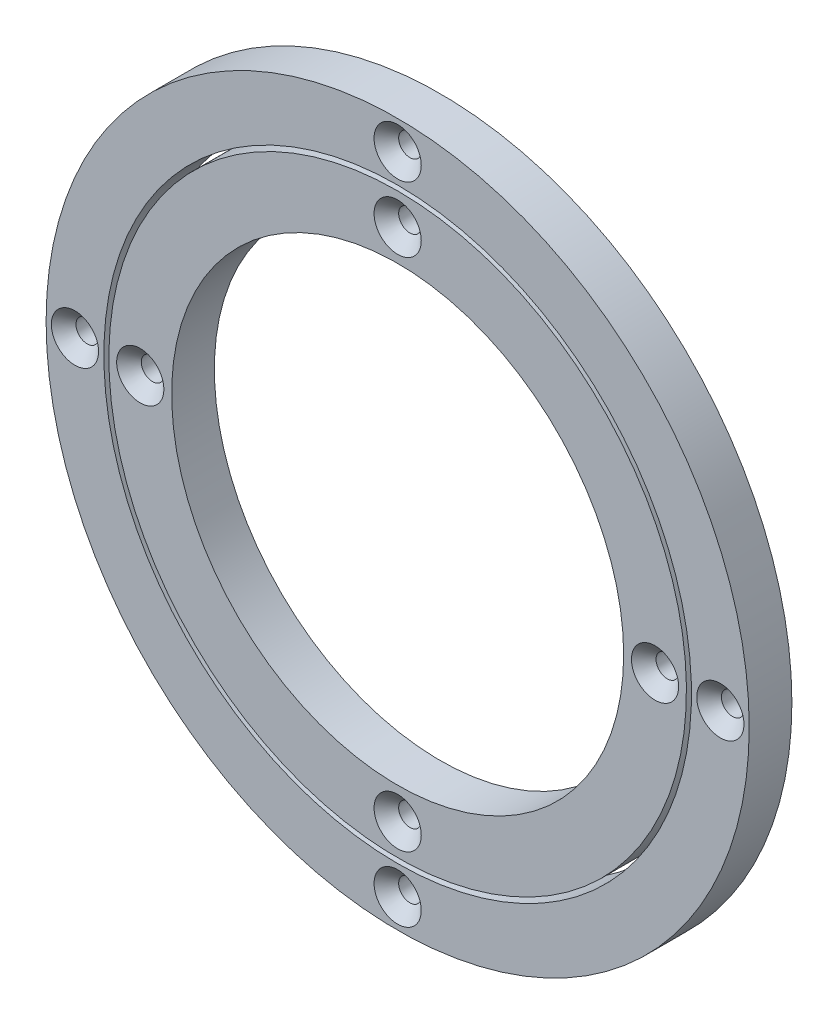
ISO-10303-21;
HEADER;
FILE_DESCRIPTION(('STEP AP214'),'2;1');
FILE_NAME('part.step','',(''),(''),'','','');
FILE_SCHEMA(('AUTOMOTIVE_DESIGN { 1 0 10303 214 1 1 1 1 }'));
ENDSEC;
DATA;
#1=APPLICATION_CONTEXT('core data for automotive mechanical design processes');
#2=APPLICATION_PROTOCOL_DEFINITION('international standard','automotive_design',2000,#1);
#3=PRODUCT_CONTEXT('',#1,'mechanical');
#4=PRODUCT('Part','Part','',(#3));
#5=PRODUCT_RELATED_PRODUCT_CATEGORY('part','',(#4));
#6=PRODUCT_DEFINITION_FORMATION('','',#4);
#7=PRODUCT_DEFINITION_CONTEXT('part definition',#1,'design');
#8=PRODUCT_DEFINITION('design','',#6,#7);
#9=PRODUCT_DEFINITION_SHAPE('','',#8);
#10=(LENGTH_UNIT() NAMED_UNIT(*) SI_UNIT(.MILLI.,.METRE.));
#11=(NAMED_UNIT(*) PLANE_ANGLE_UNIT() SI_UNIT($,.RADIAN.));
#12=(NAMED_UNIT(*) SI_UNIT($,.STERADIAN.) SOLID_ANGLE_UNIT());
#13=UNCERTAINTY_MEASURE_WITH_UNIT(LENGTH_MEASURE(1.E-05),#10,'distance_accuracy_value','');
#14=(GEOMETRIC_REPRESENTATION_CONTEXT(3) GLOBAL_UNCERTAINTY_ASSIGNED_CONTEXT((#13)) GLOBAL_UNIT_ASSIGNED_CONTEXT((#10,
#11,#12)) REPRESENTATION_CONTEXT('',''));
#15=CARTESIAN_POINT('',(0.,0.,0.));
#16=DIRECTION('',(0.,0.,1.));
#17=DIRECTION('',(1.,0.,0.));
#18=AXIS2_PLACEMENT_3D('',#15,#16,#17);
#19=CARTESIAN_POINT('',(0.,0.,8.5));
#20=DIRECTION('',(0.,0.,1.));
#21=DIRECTION('',(1.,0.,0.));
#22=AXIS2_PLACEMENT_3D('',#19,#20,#21);
#23=PLANE('',#22);
#24=CARTESIAN_POINT('',(64.25,0.,8.5));
#25=DIRECTION('',(0.,0.,1.));
#26=DIRECTION('',(1.,0.,0.));
#27=AXIS2_PLACEMENT_3D('',#24,#25,#26);
#28=CIRCLE('',#27,4.7);
#29=CARTESIAN_POINT('',(68.95,0.,8.5));
#30=VERTEX_POINT('',#29);
#31=EDGE_CURVE('E116',#30,#30,#28,.T.);
#32=ORIENTED_EDGE('',*,*,#31,.F.);
#33=EDGE_LOOP('',(#32));
#34=FACE_BOUND('',#33,.T.);
#35=CARTESIAN_POINT('',(0.,-64.25,8.5));
#36=DIRECTION('',(0.,0.,1.));
#37=DIRECTION('',(1.,0.,0.));
#38=AXIS2_PLACEMENT_3D('',#35,#36,#37);
#39=CIRCLE('',#38,4.7);
#40=CARTESIAN_POINT('',(4.7,-64.25,8.5));
#41=VERTEX_POINT('',#40);
#42=EDGE_CURVE('E107',#41,#41,#39,.T.);
#43=ORIENTED_EDGE('',*,*,#42,.F.);
#44=EDGE_LOOP('',(#43));
#45=FACE_BOUND('',#44,.T.);
#46=CARTESIAN_POINT('',(0.,64.25,8.5));
#47=DIRECTION('',(0.,0.,1.));
#48=DIRECTION('',(1.,0.,0.));
#49=AXIS2_PLACEMENT_3D('',#46,#47,#48);
#50=CIRCLE('',#49,4.7);
#51=CARTESIAN_POINT('',(4.7,64.25,8.5));
#52=VERTEX_POINT('',#51);
#53=EDGE_CURVE('E98',#52,#52,#50,.T.);
#54=ORIENTED_EDGE('',*,*,#53,.F.);
#55=EDGE_LOOP('',(#54));
#56=FACE_BOUND('',#55,.T.);
#57=CARTESIAN_POINT('',(-64.25,0.,8.5));
#58=DIRECTION('',(0.,0.,1.));
#59=DIRECTION('',(1.,0.,0.));
#60=AXIS2_PLACEMENT_3D('',#57,#58,#59);
#61=CIRCLE('',#60,4.7);
#62=CARTESIAN_POINT('',(-59.55,0.,8.5));
#63=VERTEX_POINT('',#62);
#64=EDGE_CURVE('E86',#63,#63,#61,.T.);
#65=ORIENTED_EDGE('',*,*,#64,.F.);
#66=EDGE_LOOP('',(#65));
#67=FACE_BOUND('',#66,.T.);
#68=CARTESIAN_POINT('',(0.,0.,8.5));
#69=DIRECTION('',(0.,0.,1.));
#70=DIRECTION('',(0.,1.,0.));
#71=AXIS2_PLACEMENT_3D('',#68,#69,#70);
#72=CIRCLE('',#71,58.5);
#73=CARTESIAN_POINT('',(0.,58.5,8.5));
#74=VERTEX_POINT('',#73);
#75=EDGE_CURVE('E12',#74,#74,#72,.T.);
#76=ORIENTED_EDGE('',*,*,#75,.F.);
#77=EDGE_LOOP('',(#76));
#78=FACE_BOUND('',#77,.T.);
#79=CARTESIAN_POINT('',(0.,0.,8.5));
#80=DIRECTION('',(0.,0.,1.));
#81=DIRECTION('',(1.,0.,0.));
#82=AXIS2_PLACEMENT_3D('',#79,#80,#81);
#83=CIRCLE('',#82,70.);
#84=CARTESIAN_POINT('',(70.,0.,8.5));
#85=VERTEX_POINT('',#84);
#86=EDGE_CURVE('E73',#85,#85,#83,.T.);
#87=ORIENTED_EDGE('',*,*,#86,.T.);
#88=EDGE_LOOP('',(#87));
#89=FACE_BOUND('',#88,.T.);
#90=ADVANCED_FACE('F57',(#34,#45,#56,#67,#78,#89),#23,.T.);
#91=CARTESIAN_POINT('',(0.,0.,0.));
#92=DIRECTION('',(0.,0.,1.));
#93=DIRECTION('',(1.,0.,0.));
#94=AXIS2_PLACEMENT_3D('',#91,#92,#93);
#95=PLANE('',#94);
#96=CARTESIAN_POINT('',(64.25,0.,0.));
#97=DIRECTION('',(0.,0.,1.));
#98=DIRECTION('',(1.,0.,0.));
#99=AXIS2_PLACEMENT_3D('',#96,#97,#98);
#100=CIRCLE('',#99,2.25);
#101=CARTESIAN_POINT('',(66.5,0.,0.));
#102=VERTEX_POINT('',#101);
#103=EDGE_CURVE('E110',#102,#102,#100,.T.);
#104=ORIENTED_EDGE('',*,*,#103,.T.);
#105=EDGE_LOOP('',(#104));
#106=FACE_BOUND('',#105,.T.);
#107=CARTESIAN_POINT('',(0.,-64.25,0.));
#108=DIRECTION('',(0.,0.,1.));
#109=DIRECTION('',(1.,0.,0.));
#110=AXIS2_PLACEMENT_3D('',#107,#108,#109);
#111=CIRCLE('',#110,2.25);
#112=CARTESIAN_POINT('',(2.25,-64.25,0.));
#113=VERTEX_POINT('',#112);
#114=EDGE_CURVE('E101',#113,#113,#111,.T.);
#115=ORIENTED_EDGE('',*,*,#114,.T.);
#116=EDGE_LOOP('',(#115));
#117=FACE_BOUND('',#116,.T.);
#118=CARTESIAN_POINT('',(0.,64.25,0.));
#119=DIRECTION('',(0.,0.,1.));
#120=DIRECTION('',(1.,0.,0.));
#121=AXIS2_PLACEMENT_3D('',#118,#119,#120);
#122=CIRCLE('',#121,2.25);
#123=CARTESIAN_POINT('',(2.25,64.25,0.));
#124=VERTEX_POINT('',#123);
#125=EDGE_CURVE('E90',#124,#124,#122,.T.);
#126=ORIENTED_EDGE('',*,*,#125,.T.);
#127=EDGE_LOOP('',(#126));
#128=FACE_BOUND('',#127,.T.);
#129=CARTESIAN_POINT('',(-64.25,0.,0.));
#130=DIRECTION('',(0.,0.,1.));
#131=DIRECTION('',(1.,0.,0.));
#132=AXIS2_PLACEMENT_3D('',#129,#130,#131);
#133=CIRCLE('',#132,2.25);
#134=CARTESIAN_POINT('',(-62.,0.,0.));
#135=VERTEX_POINT('',#134);
#136=EDGE_CURVE('E76',#135,#135,#133,.T.);
#137=ORIENTED_EDGE('',*,*,#136,.T.);
#138=EDGE_LOOP('',(#137));
#139=FACE_BOUND('',#138,.T.);
#140=CARTESIAN_POINT('',(0.,0.,0.));
#141=DIRECTION('',(0.,0.,1.));
#142=DIRECTION('',(0.,1.,0.));
#143=AXIS2_PLACEMENT_3D('',#140,#141,#142);
#144=CIRCLE('',#143,58.5);
#145=CARTESIAN_POINT('',(0.,58.5,0.));
#146=VERTEX_POINT('',#145);
#147=EDGE_CURVE('E68',#146,#146,#144,.T.);
#148=ORIENTED_EDGE('',*,*,#147,.T.);
#149=EDGE_LOOP('',(#148));
#150=FACE_BOUND('',#149,.T.);
#151=CARTESIAN_POINT('',(0.,0.,0.));
#152=DIRECTION('',(0.,0.,1.));
#153=DIRECTION('',(1.,0.,0.));
#154=AXIS2_PLACEMENT_3D('',#151,#152,#153);
#155=CIRCLE('',#154,70.);
#156=CARTESIAN_POINT('',(70.,0.,0.));
#157=VERTEX_POINT('',#156);
#158=EDGE_CURVE('E64',#157,#157,#155,.T.);
#159=ORIENTED_EDGE('',*,*,#158,.F.);
#160=EDGE_LOOP('',(#159));
#161=FACE_BOUND('',#160,.T.);
#162=ADVANCED_FACE('F59',(#106,#117,#128,#139,#150,#161),#95,.F.);
#163=CARTESIAN_POINT('',(0.,0.,8.5));
#164=DIRECTION('',(0.,0.,-1.));
#165=DIRECTION('',(-1.,0.,0.));
#166=AXIS2_PLACEMENT_3D('',#163,#164,#165);
#167=CYLINDRICAL_SURFACE('',#166,70.);
#168=ORIENTED_EDGE('',*,*,#86,.F.);
#169=EDGE_LOOP('',(#168));
#170=FACE_BOUND('',#169,.T.);
#171=ORIENTED_EDGE('',*,*,#158,.T.);
#172=EDGE_LOOP('',(#171));
#173=FACE_BOUND('',#172,.T.);
#174=ADVANCED_FACE('F149',(#170,#173),#167,.T.);
#175=CARTESIAN_POINT('',(0.,0.,8.5));
#176=DIRECTION('',(0.,0.,-1.));
#177=DIRECTION('',(-1.,0.,0.));
#178=AXIS2_PLACEMENT_3D('',#175,#176,#177);
#179=CYLINDRICAL_SURFACE('',#178,58.5);
#180=ORIENTED_EDGE('',*,*,#75,.T.);
#181=EDGE_LOOP('',(#180));
#182=FACE_BOUND('',#181,.T.);
#183=ORIENTED_EDGE('',*,*,#147,.F.);
#184=EDGE_LOOP('',(#183));
#185=FACE_BOUND('',#184,.T.);
#186=ADVANCED_FACE('F144',(#182,#185),#179,.F.);
#187=CARTESIAN_POINT('',(-64.25,0.,8.5));
#188=DIRECTION('',(0.,0.,1.));
#189=DIRECTION('',(1.,0.,0.));
#190=AXIS2_PLACEMENT_3D('',#187,#188,#189);
#191=CYLINDRICAL_SURFACE('',#190,2.25);
#192=ORIENTED_EDGE('',*,*,#136,.F.);
#193=EDGE_LOOP('',(#192));
#194=FACE_BOUND('',#193,.T.);
#195=CARTESIAN_POINT('',(-64.25,0.,6.05));
#196=DIRECTION('',(0.,0.,1.));
#197=DIRECTION('',(1.,0.,0.));
#198=AXIS2_PLACEMENT_3D('',#195,#196,#197);
#199=CIRCLE('',#198,2.25);
#200=CARTESIAN_POINT('',(-62.,0.,6.05));
#201=VERTEX_POINT('',#200);
#202=EDGE_CURVE('E82',#201,#201,#199,.T.);
#203=ORIENTED_EDGE('',*,*,#202,.T.);
#204=EDGE_LOOP('',(#203));
#205=FACE_BOUND('',#204,.T.);
#206=ADVANCED_FACE('F134',(#194,#205),#191,.F.);
#207=CARTESIAN_POINT('',(-64.25,0.,8.5));
#208=DIRECTION('',(0.,0.,1.));
#209=DIRECTION('',(1.,0.,0.));
#210=AXIS2_PLACEMENT_3D('',#207,#208,#209);
#211=CONICAL_SURFACE('',#210,4.7,0.785398163397449);
#212=ORIENTED_EDGE('',*,*,#202,.F.);
#213=EDGE_LOOP('',(#212));
#214=FACE_BOUND('',#213,.T.);
#215=ORIENTED_EDGE('',*,*,#64,.T.);
#216=EDGE_LOOP('',(#215));
#217=FACE_BOUND('',#216,.T.);
#218=ADVANCED_FACE('F131',(#214,#217),#211,.F.);
#219=CARTESIAN_POINT('',(0.,64.25,8.5));
#220=DIRECTION('',(0.,0.,1.));
#221=DIRECTION('',(1.,0.,0.));
#222=AXIS2_PLACEMENT_3D('',#219,#220,#221);
#223=CYLINDRICAL_SURFACE('',#222,2.25);
#224=ORIENTED_EDGE('',*,*,#125,.F.);
#225=EDGE_LOOP('',(#224));
#226=FACE_BOUND('',#225,.T.);
#227=CARTESIAN_POINT('',(0.,64.25,6.05));
#228=DIRECTION('',(0.,0.,1.));
#229=DIRECTION('',(1.,0.,0.));
#230=AXIS2_PLACEMENT_3D('',#227,#228,#229);
#231=CIRCLE('',#230,2.25);
#232=CARTESIAN_POINT('',(2.25,64.25,6.05));
#233=VERTEX_POINT('',#232);
#234=EDGE_CURVE('E95',#233,#233,#231,.T.);
#235=ORIENTED_EDGE('',*,*,#234,.T.);
#236=EDGE_LOOP('',(#235));
#237=FACE_BOUND('',#236,.T.);
#238=ADVANCED_FACE('F133',(#226,#237),#223,.F.);
#239=CARTESIAN_POINT('',(0.,64.25,8.5));
#240=DIRECTION('',(0.,0.,1.));
#241=DIRECTION('',(1.,0.,0.));
#242=AXIS2_PLACEMENT_3D('',#239,#240,#241);
#243=CONICAL_SURFACE('',#242,4.7,0.785398163397449);
#244=ORIENTED_EDGE('',*,*,#234,.F.);
#245=EDGE_LOOP('',(#244));
#246=FACE_BOUND('',#245,.T.);
#247=ORIENTED_EDGE('',*,*,#53,.T.);
#248=EDGE_LOOP('',(#247));
#249=FACE_BOUND('',#248,.T.);
#250=ADVANCED_FACE('F141',(#246,#249),#243,.F.);
#251=CARTESIAN_POINT('',(0.,-64.25,8.5));
#252=DIRECTION('',(0.,0.,1.));
#253=DIRECTION('',(1.,0.,0.));
#254=AXIS2_PLACEMENT_3D('',#251,#252,#253);
#255=CYLINDRICAL_SURFACE('',#254,2.25);
#256=ORIENTED_EDGE('',*,*,#114,.F.);
#257=EDGE_LOOP('',(#256));
#258=FACE_BOUND('',#257,.T.);
#259=CARTESIAN_POINT('',(0.,-64.25,6.05));
#260=DIRECTION('',(0.,0.,1.));
#261=DIRECTION('',(1.,0.,0.));
#262=AXIS2_PLACEMENT_3D('',#259,#260,#261);
#263=CIRCLE('',#262,2.25);
#264=CARTESIAN_POINT('',(2.25,-64.25,6.05));
#265=VERTEX_POINT('',#264);
#266=EDGE_CURVE('E104',#265,#265,#263,.T.);
#267=ORIENTED_EDGE('',*,*,#266,.T.);
#268=EDGE_LOOP('',(#267));
#269=FACE_BOUND('',#268,.T.);
#270=ADVANCED_FACE('F174',(#258,#269),#255,.F.);
#271=CARTESIAN_POINT('',(0.,-64.25,8.5));
#272=DIRECTION('',(0.,0.,1.));
#273=DIRECTION('',(1.,0.,0.));
#274=AXIS2_PLACEMENT_3D('',#271,#272,#273);
#275=CONICAL_SURFACE('',#274,4.7,0.785398163397449);
#276=ORIENTED_EDGE('',*,*,#266,.F.);
#277=EDGE_LOOP('',(#276));
#278=FACE_BOUND('',#277,.T.);
#279=ORIENTED_EDGE('',*,*,#42,.T.);
#280=EDGE_LOOP('',(#279));
#281=FACE_BOUND('',#280,.T.);
#282=ADVANCED_FACE('F178',(#278,#281),#275,.F.);
#283=CARTESIAN_POINT('',(64.25,0.,8.5));
#284=DIRECTION('',(0.,0.,1.));
#285=DIRECTION('',(1.,0.,0.));
#286=AXIS2_PLACEMENT_3D('',#283,#284,#285);
#287=CYLINDRICAL_SURFACE('',#286,2.25);
#288=ORIENTED_EDGE('',*,*,#103,.F.);
#289=EDGE_LOOP('',(#288));
#290=FACE_BOUND('',#289,.T.);
#291=CARTESIAN_POINT('',(64.25,0.,6.05));
#292=DIRECTION('',(0.,0.,1.));
#293=DIRECTION('',(1.,0.,0.));
#294=AXIS2_PLACEMENT_3D('',#291,#292,#293);
#295=CIRCLE('',#294,2.25);
#296=CARTESIAN_POINT('',(66.5,0.,6.05));
#297=VERTEX_POINT('',#296);
#298=EDGE_CURVE('E113',#297,#297,#295,.T.);
#299=ORIENTED_EDGE('',*,*,#298,.T.);
#300=EDGE_LOOP('',(#299));
#301=FACE_BOUND('',#300,.T.);
#302=ADVANCED_FACE('F184',(#290,#301),#287,.F.);
#303=CARTESIAN_POINT('',(64.25,0.,8.5));
#304=DIRECTION('',(0.,0.,1.));
#305=DIRECTION('',(1.,0.,0.));
#306=AXIS2_PLACEMENT_3D('',#303,#304,#305);
#307=CONICAL_SURFACE('',#306,4.7,0.785398163397447);
#308=ORIENTED_EDGE('',*,*,#298,.F.);
#309=EDGE_LOOP('',(#308));
#310=FACE_BOUND('',#309,.T.);
#311=ORIENTED_EDGE('',*,*,#31,.T.);
#312=EDGE_LOOP('',(#311));
#313=FACE_BOUND('',#312,.T.);
#314=ADVANCED_FACE('F120',(#310,#313),#307,.F.);
#315=CLOSED_SHELL('',(#90,#162,#174,#186,#206,#218,#238,#250,#270,#282,#302,#314));
#316=MANIFOLD_SOLID_BREP('B2',#315);
#317=CARTESIAN_POINT('',(0.,0.,8.5));
#318=DIRECTION('',(0.,0.,1.));
#319=DIRECTION('',(1.,0.,0.));
#320=AXIS2_PLACEMENT_3D('',#317,#318,#319);
#321=PLANE('',#320);
#322=CARTESIAN_POINT('',(51.25,0.,8.5));
#323=DIRECTION('',(0.,0.,1.));
#324=DIRECTION('',(1.,0.,0.));
#325=AXIS2_PLACEMENT_3D('',#322,#323,#324);
#326=CIRCLE('',#325,4.7);
#327=CARTESIAN_POINT('',(55.95,0.,8.5));
#328=VERTEX_POINT('',#327);
#329=EDGE_CURVE('E314',#328,#328,#326,.T.);
#330=ORIENTED_EDGE('',*,*,#329,.F.);
#331=EDGE_LOOP('',(#330));
#332=FACE_BOUND('',#331,.T.);
#333=CARTESIAN_POINT('',(-1.78938418615711E-13,-51.25,8.5));
#334=DIRECTION('',(0.,0.,1.));
#335=DIRECTION('',(1.,0.,0.));
#336=AXIS2_PLACEMENT_3D('',#333,#334,#335);
#337=CIRCLE('',#336,4.7);
#338=CARTESIAN_POINT('',(4.69999999999982,-51.25,8.5));
#339=VERTEX_POINT('',#338);
#340=EDGE_CURVE('E305',#339,#339,#337,.T.);
#341=ORIENTED_EDGE('',*,*,#340,.F.);
#342=EDGE_LOOP('',(#341));
#343=FACE_BOUND('',#342,.T.);
#344=CARTESIAN_POINT('',(-51.25,3.57876837231421E-13,8.5));
#345=DIRECTION('',(0.,0.,1.));
#346=DIRECTION('',(1.,0.,0.));
#347=AXIS2_PLACEMENT_3D('',#344,#345,#346);
#348=CIRCLE('',#347,4.7);
#349=CARTESIAN_POINT('',(-46.55,3.57876837231421E-13,8.5));
#350=VERTEX_POINT('',#349);
#351=EDGE_CURVE('E296',#350,#350,#348,.T.);
#352=ORIENTED_EDGE('',*,*,#351,.F.);
#353=EDGE_LOOP('',(#352));
#354=FACE_BOUND('',#353,.T.);
#355=CARTESIAN_POINT('',(5.36815255847132E-13,51.25,8.5));
#356=DIRECTION('',(0.,0.,1.));
#357=DIRECTION('',(1.,0.,0.));
#358=AXIS2_PLACEMENT_3D('',#355,#356,#357);
#359=CIRCLE('',#358,4.7);
#360=CARTESIAN_POINT('',(4.70000000000054,51.25,8.5));
#361=VERTEX_POINT('',#360);
#362=EDGE_CURVE('E287',#361,#361,#359,.T.);
#363=ORIENTED_EDGE('',*,*,#362,.F.);
#364=EDGE_LOOP('',(#363));
#365=FACE_BOUND('',#364,.T.);
#366=CARTESIAN_POINT('',(0.,0.,8.5));
#367=DIRECTION('',(0.,0.,1.));
#368=DIRECTION('',(1.,0.,0.));
#369=AXIS2_PLACEMENT_3D('',#366,#367,#368);
#370=CIRCLE('',#369,45.);
#371=CARTESIAN_POINT('',(45.,0.,8.5));
#372=VERTEX_POINT('',#371);
#373=EDGE_CURVE('E56',#372,#372,#370,.T.);
#374=ORIENTED_EDGE('',*,*,#373,.F.);
#375=EDGE_LOOP('',(#374));
#376=FACE_BOUND('',#375,.T.);
#377=CARTESIAN_POINT('',(0.,0.,8.5));
#378=DIRECTION('',(0.,0.,1.));
#379=DIRECTION('',(0.,1.,0.));
#380=AXIS2_PLACEMENT_3D('',#377,#378,#379);
#381=CIRCLE('',#380,57.5);
#382=CARTESIAN_POINT('',(0.,57.5,8.5));
#383=VERTEX_POINT('',#382);
#384=EDGE_CURVE('E274',#383,#383,#381,.T.);
#385=ORIENTED_EDGE('',*,*,#384,.T.);
#386=EDGE_LOOP('',(#385));
#387=FACE_BOUND('',#386,.T.);
#388=ADVANCED_FACE('F263',(#332,#343,#354,#365,#376,#387),#321,.T.);
#389=CARTESIAN_POINT('',(0.,0.,8.5));
#390=DIRECTION('',(0.,0.,-1.));
#391=DIRECTION('',(-1.,0.,0.));
#392=AXIS2_PLACEMENT_3D('',#389,#390,#391);
#393=CYLINDRICAL_SURFACE('',#392,45.);
#394=ORIENTED_EDGE('',*,*,#373,.T.);
#395=EDGE_LOOP('',(#394));
#396=FACE_BOUND('',#395,.T.);
#397=CARTESIAN_POINT('',(0.,0.,0.));
#398=DIRECTION('',(0.,0.,1.));
#399=DIRECTION('',(1.,0.,0.));
#400=AXIS2_PLACEMENT_3D('',#397,#398,#399);
#401=CIRCLE('',#400,45.);
#402=CARTESIAN_POINT('',(45.,0.,0.));
#403=VERTEX_POINT('',#402);
#404=EDGE_CURVE('E267',#403,#403,#401,.T.);
#405=ORIENTED_EDGE('',*,*,#404,.F.);
#406=EDGE_LOOP('',(#405));
#407=FACE_BOUND('',#406,.T.);
#408=ADVANCED_FACE('F322',(#396,#407),#393,.F.);
#409=CARTESIAN_POINT('',(0.,0.,0.));
#410=DIRECTION('',(0.,0.,1.));
#411=DIRECTION('',(1.,0.,0.));
#412=AXIS2_PLACEMENT_3D('',#409,#410,#411);
#413=PLANE('',#412);
#414=CARTESIAN_POINT('',(51.25,0.,0.));
#415=DIRECTION('',(0.,0.,1.));
#416=DIRECTION('',(1.,0.,0.));
#417=AXIS2_PLACEMENT_3D('',#414,#415,#416);
#418=CIRCLE('',#417,2.25);
#419=CARTESIAN_POINT('',(53.5,0.,0.));
#420=VERTEX_POINT('',#419);
#421=EDGE_CURVE('E308',#420,#420,#418,.T.);
#422=ORIENTED_EDGE('',*,*,#421,.T.);
#423=EDGE_LOOP('',(#422));
#424=FACE_BOUND('',#423,.T.);
#425=CARTESIAN_POINT('',(-1.78938418615711E-13,-51.25,0.));
#426=DIRECTION('',(0.,0.,1.));
#427=DIRECTION('',(1.,0.,0.));
#428=AXIS2_PLACEMENT_3D('',#425,#426,#427);
#429=CIRCLE('',#428,2.25);
#430=CARTESIAN_POINT('',(2.24999999999982,-51.25,0.));
#431=VERTEX_POINT('',#430);
#432=EDGE_CURVE('E299',#431,#431,#429,.T.);
#433=ORIENTED_EDGE('',*,*,#432,.T.);
#434=EDGE_LOOP('',(#433));
#435=FACE_BOUND('',#434,.T.);
#436=CARTESIAN_POINT('',(-51.25,3.57876837231421E-13,0.));
#437=DIRECTION('',(0.,0.,1.));
#438=DIRECTION('',(1.,0.,0.));
#439=AXIS2_PLACEMENT_3D('',#436,#437,#438);
#440=CIRCLE('',#439,2.25);
#441=CARTESIAN_POINT('',(-49.,3.57876837231421E-13,0.));
#442=VERTEX_POINT('',#441);
#443=EDGE_CURVE('E290',#442,#442,#440,.T.);
#444=ORIENTED_EDGE('',*,*,#443,.T.);
#445=EDGE_LOOP('',(#444));
#446=FACE_BOUND('',#445,.T.);
#447=CARTESIAN_POINT('',(5.36815255847132E-13,51.25,0.));
#448=DIRECTION('',(0.,0.,1.));
#449=DIRECTION('',(1.,0.,0.));
#450=AXIS2_PLACEMENT_3D('',#447,#448,#449);
#451=CIRCLE('',#450,2.25);
#452=CARTESIAN_POINT('',(2.25000000000054,51.25,0.));
#453=VERTEX_POINT('',#452);
#454=EDGE_CURVE('E279',#453,#453,#451,.T.);
#455=ORIENTED_EDGE('',*,*,#454,.T.);
#456=EDGE_LOOP('',(#455));
#457=FACE_BOUND('',#456,.T.);
#458=ORIENTED_EDGE('',*,*,#404,.T.);
#459=EDGE_LOOP('',(#458));
#460=FACE_BOUND('',#459,.T.);
#461=CARTESIAN_POINT('',(0.,0.,0.));
#462=DIRECTION('',(0.,0.,1.));
#463=DIRECTION('',(0.,1.,0.));
#464=AXIS2_PLACEMENT_3D('',#461,#462,#463);
#465=CIRCLE('',#464,57.5);
#466=CARTESIAN_POINT('',(0.,57.5,0.));
#467=VERTEX_POINT('',#466);
#468=EDGE_CURVE('E276',#467,#467,#465,.T.);
#469=ORIENTED_EDGE('',*,*,#468,.F.);
#470=EDGE_LOOP('',(#469));
#471=FACE_BOUND('',#470,.T.);
#472=ADVANCED_FACE('F265',(#424,#435,#446,#457,#460,#471),#413,.F.);
#473=CARTESIAN_POINT('',(0.,0.,8.5));
#474=DIRECTION('',(0.,0.,-1.));
#475=DIRECTION('',(-1.,0.,0.));
#476=AXIS2_PLACEMENT_3D('',#473,#474,#475);
#477=CYLINDRICAL_SURFACE('',#476,57.5);
#478=ORIENTED_EDGE('',*,*,#384,.F.);
#479=EDGE_LOOP('',(#478));
#480=FACE_BOUND('',#479,.T.);
#481=ORIENTED_EDGE('',*,*,#468,.T.);
#482=EDGE_LOOP('',(#481));
#483=FACE_BOUND('',#482,.T.);
#484=ADVANCED_FACE('F332',(#480,#483),#477,.T.);
#485=CARTESIAN_POINT('',(5.36815255847132E-13,51.25,8.5));
#486=DIRECTION('',(0.,0.,1.));
#487=DIRECTION('',(1.,0.,0.));
#488=AXIS2_PLACEMENT_3D('',#485,#486,#487);
#489=CYLINDRICAL_SURFACE('',#488,2.25);
#490=ORIENTED_EDGE('',*,*,#454,.F.);
#491=EDGE_LOOP('',(#490));
#492=FACE_BOUND('',#491,.T.);
#493=CARTESIAN_POINT('',(5.36815255847132E-13,51.25,6.05));
#494=DIRECTION('',(0.,0.,1.));
#495=DIRECTION('',(1.,0.,0.));
#496=AXIS2_PLACEMENT_3D('',#493,#494,#495);
#497=CIRCLE('',#496,2.25);
#498=CARTESIAN_POINT('',(2.25000000000054,51.25,6.05));
#499=VERTEX_POINT('',#498);
#500=EDGE_CURVE('E284',#499,#499,#497,.T.);
#501=ORIENTED_EDGE('',*,*,#500,.T.);
#502=EDGE_LOOP('',(#501));
#503=FACE_BOUND('',#502,.T.);
#504=ADVANCED_FACE('F335',(#492,#503),#489,.F.);
#505=CARTESIAN_POINT('',(5.36815255847132E-13,51.25,8.5));
#506=DIRECTION('',(0.,0.,1.));
#507=DIRECTION('',(1.,0.,0.));
#508=AXIS2_PLACEMENT_3D('',#505,#506,#507);
#509=CONICAL_SURFACE('',#508,4.7,0.785398163397449);
#510=ORIENTED_EDGE('',*,*,#500,.F.);
#511=EDGE_LOOP('',(#510));
#512=FACE_BOUND('',#511,.T.);
#513=ORIENTED_EDGE('',*,*,#362,.T.);
#514=EDGE_LOOP('',(#513));
#515=FACE_BOUND('',#514,.T.);
#516=ADVANCED_FACE('F358',(#512,#515),#509,.F.);
#517=CARTESIAN_POINT('',(-51.25,3.57876837231421E-13,8.5));
#518=DIRECTION('',(0.,0.,1.));
#519=DIRECTION('',(1.,0.,0.));
#520=AXIS2_PLACEMENT_3D('',#517,#518,#519);
#521=CYLINDRICAL_SURFACE('',#520,2.25);
#522=ORIENTED_EDGE('',*,*,#443,.F.);
#523=EDGE_LOOP('',(#522));
#524=FACE_BOUND('',#523,.T.);
#525=CARTESIAN_POINT('',(-51.25,3.57876837231421E-13,6.05));
#526=DIRECTION('',(0.,0.,1.));
#527=DIRECTION('',(1.,0.,0.));
#528=AXIS2_PLACEMENT_3D('',#525,#526,#527);
#529=CIRCLE('',#528,2.25);
#530=CARTESIAN_POINT('',(-49.,3.57876837231421E-13,6.05));
#531=VERTEX_POINT('',#530);
#532=EDGE_CURVE('E293',#531,#531,#529,.T.);
#533=ORIENTED_EDGE('',*,*,#532,.T.);
#534=EDGE_LOOP('',(#533));
#535=FACE_BOUND('',#534,.T.);
#536=ADVANCED_FACE('F364',(#524,#535),#521,.F.);
#537=CARTESIAN_POINT('',(-51.25,3.57876837231421E-13,8.5));
#538=DIRECTION('',(0.,0.,1.));
#539=DIRECTION('',(1.,0.,0.));
#540=AXIS2_PLACEMENT_3D('',#537,#538,#539);
#541=CONICAL_SURFACE('',#540,4.7,0.785398163397449);
#542=ORIENTED_EDGE('',*,*,#532,.F.);
#543=EDGE_LOOP('',(#542));
#544=FACE_BOUND('',#543,.T.);
#545=ORIENTED_EDGE('',*,*,#351,.T.);
#546=EDGE_LOOP('',(#545));
#547=FACE_BOUND('',#546,.T.);
#548=ADVANCED_FACE('F369',(#544,#547),#541,.F.);
#549=CARTESIAN_POINT('',(-1.78938418615711E-13,-51.25,8.5));
#550=DIRECTION('',(0.,0.,1.));
#551=DIRECTION('',(1.,0.,0.));
#552=AXIS2_PLACEMENT_3D('',#549,#550,#551);
#553=CYLINDRICAL_SURFACE('',#552,2.25);
#554=ORIENTED_EDGE('',*,*,#432,.F.);
#555=EDGE_LOOP('',(#554));
#556=FACE_BOUND('',#555,.T.);
#557=CARTESIAN_POINT('',(-1.78938418615711E-13,-51.25,6.05));
#558=DIRECTION('',(0.,0.,1.));
#559=DIRECTION('',(1.,0.,0.));
#560=AXIS2_PLACEMENT_3D('',#557,#558,#559);
#561=CIRCLE('',#560,2.25);
#562=CARTESIAN_POINT('',(2.24999999999982,-51.25,6.05));
#563=VERTEX_POINT('',#562);
#564=EDGE_CURVE('E302',#563,#563,#561,.T.);
#565=ORIENTED_EDGE('',*,*,#564,.T.);
#566=EDGE_LOOP('',(#565));
#567=FACE_BOUND('',#566,.T.);
#568=ADVANCED_FACE('F375',(#556,#567),#553,.F.);
#569=CARTESIAN_POINT('',(-1.78938418615711E-13,-51.25,8.5));
#570=DIRECTION('',(0.,0.,1.));
#571=DIRECTION('',(1.,0.,0.));
#572=AXIS2_PLACEMENT_3D('',#569,#570,#571);
#573=CONICAL_SURFACE('',#572,4.7,0.785398163397449);
#574=ORIENTED_EDGE('',*,*,#564,.F.);
#575=EDGE_LOOP('',(#574));
#576=FACE_BOUND('',#575,.T.);
#577=ORIENTED_EDGE('',*,*,#340,.T.);
#578=EDGE_LOOP('',(#577));
#579=FACE_BOUND('',#578,.T.);
#580=ADVANCED_FACE('F379',(#576,#579),#573,.F.);
#581=CARTESIAN_POINT('',(51.25,0.,8.5));
#582=DIRECTION('',(0.,0.,1.));
#583=DIRECTION('',(1.,0.,0.));
#584=AXIS2_PLACEMENT_3D('',#581,#582,#583);
#585=CYLINDRICAL_SURFACE('',#584,2.25);
#586=ORIENTED_EDGE('',*,*,#421,.F.);
#587=EDGE_LOOP('',(#586));
#588=FACE_BOUND('',#587,.T.);
#589=CARTESIAN_POINT('',(51.25,0.,6.05));
#590=DIRECTION('',(0.,0.,1.));
#591=DIRECTION('',(1.,0.,0.));
#592=AXIS2_PLACEMENT_3D('',#589,#590,#591);
#593=CIRCLE('',#592,2.25);
#594=CARTESIAN_POINT('',(53.5,0.,6.05));
#595=VERTEX_POINT('',#594);
#596=EDGE_CURVE('E311',#595,#595,#593,.T.);
#597=ORIENTED_EDGE('',*,*,#596,.T.);
#598=EDGE_LOOP('',(#597));
#599=FACE_BOUND('',#598,.T.);
#600=ADVANCED_FACE('F383',(#588,#599),#585,.F.);
#601=CARTESIAN_POINT('',(51.25,0.,8.5));
#602=DIRECTION('',(0.,0.,1.));
#603=DIRECTION('',(1.,0.,0.));
#604=AXIS2_PLACEMENT_3D('',#601,#602,#603);
#605=CONICAL_SURFACE('',#604,4.7,0.785398163397449);
#606=ORIENTED_EDGE('',*,*,#596,.F.);
#607=EDGE_LOOP('',(#606));
#608=FACE_BOUND('',#607,.T.);
#609=ORIENTED_EDGE('',*,*,#329,.T.);
#610=EDGE_LOOP('',(#609));
#611=FACE_BOUND('',#610,.T.);
#612=ADVANCED_FACE('F318',(#608,#611),#605,.F.);
#613=CLOSED_SHELL('',(#388,#408,#472,#484,#504,#516,#536,#548,#568,#580,#600,#612));
#614=MANIFOLD_SOLID_BREP('B7',#613);
#615=ADVANCED_BREP_SHAPE_REPRESENTATION('',(#18,#316,#614),#14);
#616=SHAPE_DEFINITION_REPRESENTATION(#9,#615);
ENDSEC;
END-ISO-10303-21;
